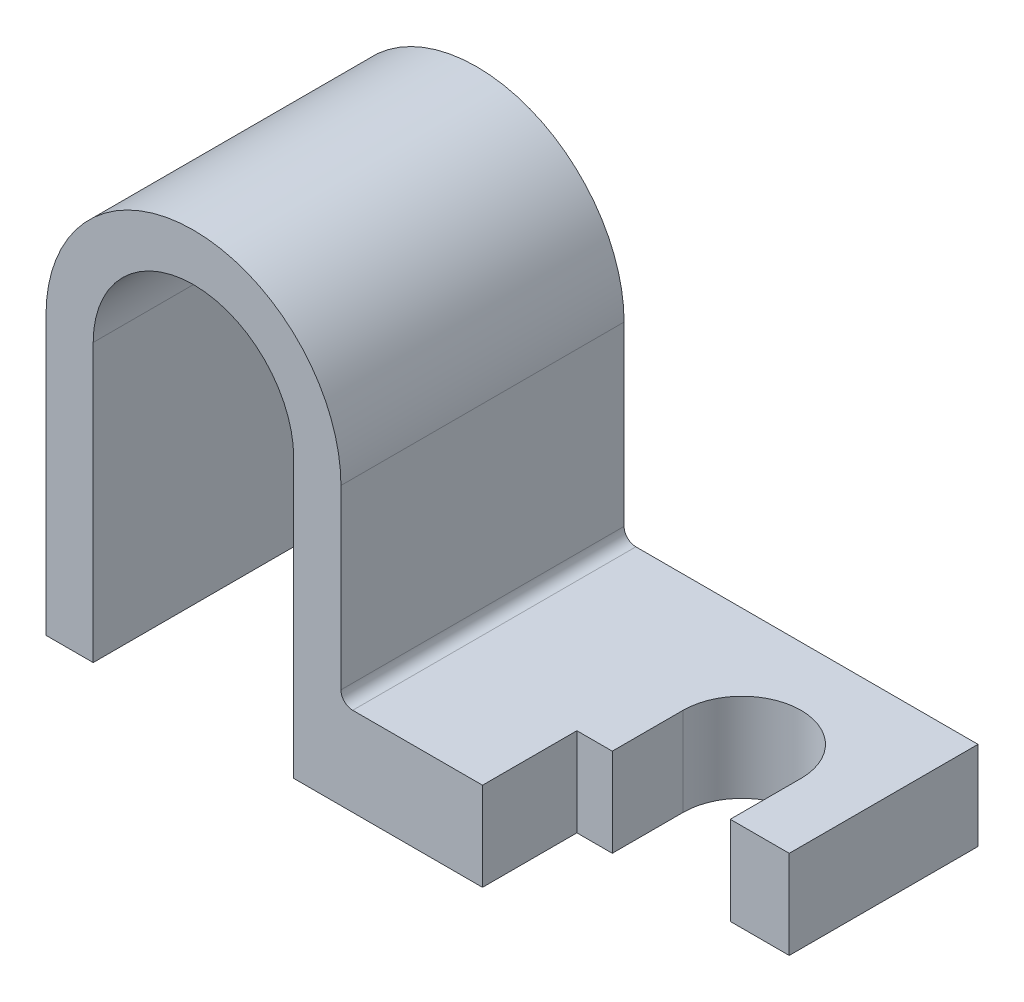
ISO-10303-21;
HEADER;
FILE_DESCRIPTION(('STEP AP214'),'2;1');
FILE_NAME('part.step','',(''),(''),'','','');
FILE_SCHEMA(('AUTOMOTIVE_DESIGN { 1 0 10303 214 1 1 1 1 }'));
ENDSEC;
DATA;
#1=APPLICATION_CONTEXT('core data for automotive mechanical design processes');
#2=APPLICATION_PROTOCOL_DEFINITION('international standard','automotive_design',2000,#1);
#3=PRODUCT_CONTEXT('',#1,'mechanical');
#4=PRODUCT('Part','Part','',(#3));
#5=PRODUCT_RELATED_PRODUCT_CATEGORY('part','',(#4));
#6=PRODUCT_DEFINITION_FORMATION('','',#4);
#7=PRODUCT_DEFINITION_CONTEXT('part definition',#1,'design');
#8=PRODUCT_DEFINITION('design','',#6,#7);
#9=PRODUCT_DEFINITION_SHAPE('','',#8);
#10=(LENGTH_UNIT() NAMED_UNIT(*) SI_UNIT(.MILLI.,.METRE.));
#11=(NAMED_UNIT(*) PLANE_ANGLE_UNIT() SI_UNIT($,.RADIAN.));
#12=(NAMED_UNIT(*) SI_UNIT($,.STERADIAN.) SOLID_ANGLE_UNIT());
#13=UNCERTAINTY_MEASURE_WITH_UNIT(LENGTH_MEASURE(1.E-05),#10,'distance_accuracy_value','');
#14=(GEOMETRIC_REPRESENTATION_CONTEXT(3) GLOBAL_UNCERTAINTY_ASSIGNED_CONTEXT((#13)) GLOBAL_UNIT_ASSIGNED_CONTEXT((#10,
#11,#12)) REPRESENTATION_CONTEXT('',''));
#15=CARTESIAN_POINT('',(0.,0.,0.));
#16=DIRECTION('',(0.,0.,1.));
#17=DIRECTION('',(1.,0.,0.));
#18=AXIS2_PLACEMENT_3D('',#15,#16,#17);
#19=CARTESIAN_POINT('',(0.,47.,-48.));
#20=DIRECTION('',(-1.,0.,0.));
#21=DIRECTION('',(0.,0.,1.));
#22=AXIS2_PLACEMENT_3D('',#19,#20,#21);
#23=PLANE('',#22);
#24=DIRECTION('',(0.,-1.,0.));
#25=VECTOR('',#24,1.);
#26=CARTESIAN_POINT('',(0.,47.,0.));
#27=LINE('',#26,#25);
#28=CARTESIAN_POINT('',(0.,47.,0.));
#29=VERTEX_POINT('',#28);
#30=CARTESIAN_POINT('',(0.,0.,0.));
#31=VERTEX_POINT('',#30);
#32=EDGE_CURVE('E243',#29,#31,#27,.T.);
#33=ORIENTED_EDGE('',*,*,#32,.F.);
#34=DIRECTION('',(0.,0.,1.));
#35=VECTOR('',#34,1.);
#36=CARTESIAN_POINT('',(0.,47.,-48.));
#37=LINE('',#36,#35);
#38=CARTESIAN_POINT('',(0.,47.,-48.));
#39=VERTEX_POINT('',#38);
#40=EDGE_CURVE('E181',#39,#29,#37,.T.);
#41=ORIENTED_EDGE('',*,*,#40,.F.);
#42=DIRECTION('',(0.,-1.,0.));
#43=VECTOR('',#42,1.);
#44=CARTESIAN_POINT('',(0.,47.,-48.));
#45=LINE('',#44,#43);
#46=CARTESIAN_POINT('',(0.,0.,-48.));
#47=VERTEX_POINT('',#46);
#48=EDGE_CURVE('E231',#39,#47,#45,.T.);
#49=ORIENTED_EDGE('',*,*,#48,.T.);
#50=DIRECTION('',(0.,0.,1.));
#51=VECTOR('',#50,1.);
#52=CARTESIAN_POINT('',(0.,0.,-48.));
#53=LINE('',#52,#51);
#54=EDGE_CURVE('E194',#47,#31,#53,.T.);
#55=ORIENTED_EDGE('',*,*,#54,.T.);
#56=EDGE_LOOP('',(#33,#41,#49,#55));
#57=FACE_BOUND('',#56,.T.);
#58=ADVANCED_FACE('F33',(#57),#23,.T.);
#59=CARTESIAN_POINT('',(25.,47.,-48.));
#60=DIRECTION('',(0.,0.,1.));
#61=DIRECTION('',(1.,0.,0.));
#62=AXIS2_PLACEMENT_3D('',#59,#60,#61);
#63=CYLINDRICAL_SURFACE('',#62,25.);
#64=CARTESIAN_POINT('',(25.,47.,0.));
#65=DIRECTION('',(0.,0.,1.));
#66=DIRECTION('',(1.,0.,0.));
#67=AXIS2_PLACEMENT_3D('',#64,#65,#66);
#68=CIRCLE('',#67,25.);
#69=CARTESIAN_POINT('',(50.,47.,0.));
#70=VERTEX_POINT('',#69);
#71=EDGE_CURVE('E224',#70,#29,#68,.T.);
#72=ORIENTED_EDGE('',*,*,#71,.F.);
#73=DIRECTION('',(0.,0.,1.));
#74=VECTOR('',#73,1.);
#75=CARTESIAN_POINT('',(50.,47.,-48.));
#76=LINE('',#75,#74);
#77=CARTESIAN_POINT('',(50.,47.,-48.));
#78=VERTEX_POINT('',#77);
#79=EDGE_CURVE('E177',#78,#70,#76,.T.);
#80=ORIENTED_EDGE('',*,*,#79,.F.);
#81=CARTESIAN_POINT('',(25.,47.,-48.));
#82=DIRECTION('',(0.,0.,1.));
#83=DIRECTION('',(1.,0.,0.));
#84=AXIS2_PLACEMENT_3D('',#81,#82,#83);
#85=CIRCLE('',#84,25.);
#86=EDGE_CURVE('E196',#78,#39,#85,.T.);
#87=ORIENTED_EDGE('',*,*,#86,.T.);
#88=ORIENTED_EDGE('',*,*,#40,.T.);
#89=EDGE_LOOP('',(#72,#80,#87,#88));
#90=FACE_BOUND('',#89,.T.);
#91=ADVANCED_FACE('F236',(#90),#63,.T.);
#92=CARTESIAN_POINT('',(50.,15.,-48.));
#93=DIRECTION('',(1.,0.,0.));
#94=DIRECTION('',(0.,0.,-1.));
#95=AXIS2_PLACEMENT_3D('',#92,#93,#94);
#96=PLANE('',#95);
#97=DIRECTION('',(0.,1.,0.));
#98=VECTOR('',#97,1.);
#99=CARTESIAN_POINT('',(50.,15.,0.));
#100=LINE('',#99,#98);
#101=CARTESIAN_POINT('',(50.,17.,0.));
#102=VERTEX_POINT('',#101);
#103=EDGE_CURVE('E221',#102,#70,#100,.T.);
#104=ORIENTED_EDGE('',*,*,#103,.F.);
#105=DIRECTION('',(0.,0.,1.));
#106=VECTOR('',#105,1.);
#107=CARTESIAN_POINT('',(50.,17.,-48.));
#108=LINE('',#107,#106);
#109=CARTESIAN_POINT('',(50.,17.,-48.));
#110=VERTEX_POINT('',#109);
#111=EDGE_CURVE('E48',#102,#110,#108,.F.);
#112=ORIENTED_EDGE('',*,*,#111,.T.);
#113=DIRECTION('',(0.,1.,0.));
#114=VECTOR('',#113,1.);
#115=CARTESIAN_POINT('',(50.,15.,-48.));
#116=LINE('',#115,#114);
#117=EDGE_CURVE('E250',#110,#78,#116,.T.);
#118=ORIENTED_EDGE('',*,*,#117,.T.);
#119=ORIENTED_EDGE('',*,*,#79,.T.);
#120=EDGE_LOOP('',(#104,#112,#118,#119));
#121=FACE_BOUND('',#120,.T.);
#122=ADVANCED_FACE('F249',(#121),#96,.T.);
#123=CARTESIAN_POINT('',(110.,15.,-48.));
#124=DIRECTION('',(0.,1.,0.));
#125=DIRECTION('',(-1.,0.,0.));
#126=AXIS2_PLACEMENT_3D('',#123,#124,#125);
#127=PLANE('',#126);
#128=DIRECTION('',(-1.,0.,0.));
#129=VECTOR('',#128,1.);
#130=CARTESIAN_POINT('',(110.,15.,-48.));
#131=LINE('',#130,#129);
#132=CARTESIAN_POINT('',(110.,15.,-48.));
#133=VERTEX_POINT('',#132);
#134=CARTESIAN_POINT('',(52.,15.,-48.));
#135=VERTEX_POINT('',#134);
#136=EDGE_CURVE('E216',#133,#135,#131,.T.);
#137=ORIENTED_EDGE('',*,*,#136,.T.);
#138=DIRECTION('',(0.,0.,1.));
#139=VECTOR('',#138,1.);
#140=CARTESIAN_POINT('',(52.,15.,0.));
#141=LINE('',#140,#139);
#142=CARTESIAN_POINT('',(52.,15.,0.));
#143=VERTEX_POINT('',#142);
#144=EDGE_CURVE('E209',#135,#143,#141,.T.);
#145=ORIENTED_EDGE('',*,*,#144,.T.);
#146=DIRECTION('',(-1.,0.,0.));
#147=VECTOR('',#146,1.);
#148=CARTESIAN_POINT('',(110.,15.,0.));
#149=LINE('',#148,#147);
#150=CARTESIAN_POINT('',(74.,15.,0.));
#151=VERTEX_POINT('',#150);
#152=EDGE_CURVE('E215',#151,#143,#149,.T.);
#153=ORIENTED_EDGE('',*,*,#152,.F.);
#154=DIRECTION('',(0.,0.,1.));
#155=VECTOR('',#154,1.);
#156=CARTESIAN_POINT('',(74.,15.,0.));
#157=LINE('',#156,#155);
#158=CARTESIAN_POINT('',(74.,15.,-16.));
#159=VERTEX_POINT('',#158);
#160=EDGE_CURVE('E162',#159,#151,#157,.T.);
#161=ORIENTED_EDGE('',*,*,#160,.F.);
#162=DIRECTION('',(-1.,0.,0.));
#163=VECTOR('',#162,1.);
#164=CARTESIAN_POINT('',(74.,15.,-16.));
#165=LINE('',#164,#163);
#166=CARTESIAN_POINT('',(80.,15.,-16.));
#167=VERTEX_POINT('',#166);
#168=EDGE_CURVE('E485',#167,#159,#165,.T.);
#169=ORIENTED_EDGE('',*,*,#168,.F.);
#170=DIRECTION('',(0.,0.,1.));
#171=VECTOR('',#170,1.);
#172=CARTESIAN_POINT('',(80.,15.,-16.));
#173=LINE('',#172,#171);
#174=CARTESIAN_POINT('',(80.,15.,-28.));
#175=VERTEX_POINT('',#174);
#176=EDGE_CURVE('E472',#175,#167,#173,.T.);
#177=ORIENTED_EDGE('',*,*,#176,.F.);
#178=CARTESIAN_POINT('',(90.,15.,-28.));
#179=DIRECTION('',(0.,1.,0.));
#180=DIRECTION('',(1.,0.,0.));
#181=AXIS2_PLACEMENT_3D('',#178,#179,#180);
#182=CIRCLE('',#181,9.99999999999999);
#183=CARTESIAN_POINT('',(100.,15.,-28.));
#184=VERTEX_POINT('',#183);
#185=EDGE_CURVE('E488',#184,#175,#182,.T.);
#186=ORIENTED_EDGE('',*,*,#185,.F.);
#187=DIRECTION('',(0.,0.,-1.));
#188=VECTOR('',#187,1.);
#189=CARTESIAN_POINT('',(100.,15.,-28.));
#190=LINE('',#189,#188);
#191=CARTESIAN_POINT('',(100.,15.,-16.));
#192=VERTEX_POINT('',#191);
#193=EDGE_CURVE('E171',#192,#184,#190,.T.);
#194=ORIENTED_EDGE('',*,*,#193,.F.);
#195=DIRECTION('',(-1.,0.,0.));
#196=VECTOR('',#195,1.);
#197=CARTESIAN_POINT('',(100.,15.,-16.));
#198=LINE('',#197,#196);
#199=CARTESIAN_POINT('',(110.,15.,-16.));
#200=VERTEX_POINT('',#199);
#201=EDGE_CURVE('E154',#200,#192,#198,.T.);
#202=ORIENTED_EDGE('',*,*,#201,.F.);
#203=DIRECTION('',(0.,0.,1.));
#204=VECTOR('',#203,1.);
#205=CARTESIAN_POINT('',(110.,15.,-48.));
#206=LINE('',#205,#204);
#207=EDGE_CURVE('E167',#133,#200,#206,.T.);
#208=ORIENTED_EDGE('',*,*,#207,.F.);
#209=EDGE_LOOP('',(#137,#145,#153,#161,#169,#177,#186,#194,#202,#208));
#210=FACE_BOUND('',#209,.T.);
#211=ADVANCED_FACE('F166',(#210),#127,.T.);
#212=CARTESIAN_POINT('',(110.,0.,-48.));
#213=DIRECTION('',(1.,0.,0.));
#214=DIRECTION('',(0.,1.,0.));
#215=AXIS2_PLACEMENT_3D('',#212,#213,#214);
#216=PLANE('',#215);
#217=DIRECTION('',(0.,1.,0.));
#218=VECTOR('',#217,1.);
#219=CARTESIAN_POINT('',(110.,-33.,-16.));
#220=LINE('',#219,#218);
#221=CARTESIAN_POINT('',(110.,0.,-16.));
#222=VERTEX_POINT('',#221);
#223=EDGE_CURVE('E150',#222,#200,#220,.T.);
#224=ORIENTED_EDGE('',*,*,#223,.F.);
#225=DIRECTION('',(0.,0.,1.));
#226=VECTOR('',#225,1.);
#227=CARTESIAN_POINT('',(110.,0.,-48.));
#228=LINE('',#227,#226);
#229=CARTESIAN_POINT('',(110.,0.,-48.));
#230=VERTEX_POINT('',#229);
#231=EDGE_CURVE('E178',#230,#222,#228,.T.);
#232=ORIENTED_EDGE('',*,*,#231,.F.);
#233=DIRECTION('',(0.,1.,0.));
#234=VECTOR('',#233,1.);
#235=CARTESIAN_POINT('',(110.,0.,-48.));
#236=LINE('',#235,#234);
#237=EDGE_CURVE('E176',#230,#133,#236,.T.);
#238=ORIENTED_EDGE('',*,*,#237,.T.);
#239=ORIENTED_EDGE('',*,*,#207,.T.);
#240=EDGE_LOOP('',(#224,#232,#238,#239));
#241=FACE_BOUND('',#240,.T.);
#242=ADVANCED_FACE('F174',(#241),#216,.T.);
#243=CARTESIAN_POINT('',(42.,0.,-48.));
#244=DIRECTION('',(0.,-1.,0.));
#245=DIRECTION('',(0.,0.,-1.));
#246=AXIS2_PLACEMENT_3D('',#243,#244,#245);
#247=PLANE('',#246);
#248=DIRECTION('',(0.,0.,-1.));
#249=VECTOR('',#248,1.);
#250=CARTESIAN_POINT('',(74.,0.,-48.));
#251=LINE('',#250,#249);
#252=CARTESIAN_POINT('',(74.,0.,0.));
#253=VERTEX_POINT('',#252);
#254=CARTESIAN_POINT('',(74.,0.,-16.));
#255=VERTEX_POINT('',#254);
#256=EDGE_CURVE('E247',#253,#255,#251,.T.);
#257=ORIENTED_EDGE('',*,*,#256,.F.);
#258=DIRECTION('',(1.,0.,0.));
#259=VECTOR('',#258,1.);
#260=CARTESIAN_POINT('',(42.,0.,0.));
#261=LINE('',#260,#259);
#262=CARTESIAN_POINT('',(42.,0.,0.));
#263=VERTEX_POINT('',#262);
#264=EDGE_CURVE('E222',#263,#253,#261,.T.);
#265=ORIENTED_EDGE('',*,*,#264,.F.);
#266=DIRECTION('',(0.,0.,1.));
#267=VECTOR('',#266,1.);
#268=CARTESIAN_POINT('',(42.,0.,-48.));
#269=LINE('',#268,#267);
#270=CARTESIAN_POINT('',(42.,0.,-48.));
#271=VERTEX_POINT('',#270);
#272=EDGE_CURVE('E183',#271,#263,#269,.T.);
#273=ORIENTED_EDGE('',*,*,#272,.F.);
#274=DIRECTION('',(1.,0.,0.));
#275=VECTOR('',#274,1.);
#276=CARTESIAN_POINT('',(42.,0.,-48.));
#277=LINE('',#276,#275);
#278=EDGE_CURVE('E299',#271,#230,#277,.T.);
#279=ORIENTED_EDGE('',*,*,#278,.T.);
#280=ORIENTED_EDGE('',*,*,#231,.T.);
#281=DIRECTION('',(1.,0.,0.));
#282=VECTOR('',#281,1.);
#283=CARTESIAN_POINT('',(42.,0.,-16.));
#284=LINE('',#283,#282);
#285=CARTESIAN_POINT('',(100.,0.,-16.));
#286=VERTEX_POINT('',#285);
#287=EDGE_CURVE('E157',#286,#222,#284,.T.);
#288=ORIENTED_EDGE('',*,*,#287,.F.);
#289=DIRECTION('',(0.,0.,1.));
#290=VECTOR('',#289,1.);
#291=CARTESIAN_POINT('',(100.,0.,-48.0000000000001));
#292=LINE('',#291,#290);
#293=CARTESIAN_POINT('',(100.,0.,-28.));
#294=VERTEX_POINT('',#293);
#295=EDGE_CURVE('E201',#294,#286,#292,.T.);
#296=ORIENTED_EDGE('',*,*,#295,.F.);
#297=CARTESIAN_POINT('',(90.,0.,-28.));
#298=DIRECTION('',(0.,-1.,0.));
#299=DIRECTION('',(0.,0.,-1.));
#300=AXIS2_PLACEMENT_3D('',#297,#298,#299);
#301=CIRCLE('',#300,9.99999999999999);
#302=CARTESIAN_POINT('',(80.,0.,-28.));
#303=VERTEX_POINT('',#302);
#304=EDGE_CURVE('E203',#303,#294,#301,.T.);
#305=ORIENTED_EDGE('',*,*,#304,.F.);
#306=DIRECTION('',(0.,0.,-1.));
#307=VECTOR('',#306,1.);
#308=CARTESIAN_POINT('',(80.,0.,-48.));
#309=LINE('',#308,#307);
#310=CARTESIAN_POINT('',(80.,0.,-16.));
#311=VERTEX_POINT('',#310);
#312=EDGE_CURVE('E205',#311,#303,#309,.T.);
#313=ORIENTED_EDGE('',*,*,#312,.F.);
#314=DIRECTION('',(1.,0.,0.));
#315=VECTOR('',#314,1.);
#316=CARTESIAN_POINT('',(42.,0.,-16.));
#317=LINE('',#316,#315);
#318=EDGE_CURVE('E207',#255,#311,#317,.T.);
#319=ORIENTED_EDGE('',*,*,#318,.F.);
#320=EDGE_LOOP('',(#257,#265,#273,#279,#280,#288,#296,#305,#313,#319));
#321=FACE_BOUND('',#320,.T.);
#322=ADVANCED_FACE('F277',(#321),#247,.T.);
#323=CARTESIAN_POINT('',(42.,47.,-48.));
#324=DIRECTION('',(-1.,0.,0.));
#325=DIRECTION('',(0.,-1.,0.));
#326=AXIS2_PLACEMENT_3D('',#323,#324,#325);
#327=PLANE('',#326);
#328=DIRECTION('',(0.,-1.,0.));
#329=VECTOR('',#328,1.);
#330=CARTESIAN_POINT('',(42.,47.,0.));
#331=LINE('',#330,#329);
#332=CARTESIAN_POINT('',(42.,47.,0.));
#333=VERTEX_POINT('',#332);
#334=EDGE_CURVE('E226',#333,#263,#331,.T.);
#335=ORIENTED_EDGE('',*,*,#334,.F.);
#336=DIRECTION('',(0.,0.,1.));
#337=VECTOR('',#336,1.);
#338=CARTESIAN_POINT('',(42.,47.,-48.));
#339=LINE('',#338,#337);
#340=CARTESIAN_POINT('',(42.,47.,-48.));
#341=VERTEX_POINT('',#340);
#342=EDGE_CURVE('E188',#341,#333,#339,.T.);
#343=ORIENTED_EDGE('',*,*,#342,.F.);
#344=DIRECTION('',(0.,-1.,0.));
#345=VECTOR('',#344,1.);
#346=CARTESIAN_POINT('',(42.,47.,-48.));
#347=LINE('',#346,#345);
#348=EDGE_CURVE('E272',#341,#271,#347,.T.);
#349=ORIENTED_EDGE('',*,*,#348,.T.);
#350=ORIENTED_EDGE('',*,*,#272,.T.);
#351=EDGE_LOOP('',(#335,#343,#349,#350));
#352=FACE_BOUND('',#351,.T.);
#353=ADVANCED_FACE('F269',(#352),#327,.T.);
#354=CARTESIAN_POINT('',(25.,47.,-48.));
#355=DIRECTION('',(0.,0.,1.));
#356=DIRECTION('',(1.,0.,0.));
#357=AXIS2_PLACEMENT_3D('',#354,#355,#356);
#358=CYLINDRICAL_SURFACE('',#357,17.);
#359=CARTESIAN_POINT('',(25.,47.,0.));
#360=DIRECTION('',(0.,0.,-1.));
#361=DIRECTION('',(-1.,0.,0.));
#362=AXIS2_PLACEMENT_3D('',#359,#360,#361);
#363=CIRCLE('',#362,17.);
#364=CARTESIAN_POINT('',(8.00000000000001,47.,0.));
#365=VERTEX_POINT('',#364);
#366=EDGE_CURVE('E262',#365,#333,#363,.T.);
#367=ORIENTED_EDGE('',*,*,#366,.F.);
#368=DIRECTION('',(0.,0.,1.));
#369=VECTOR('',#368,1.);
#370=CARTESIAN_POINT('',(8.00000000000001,47.,-48.));
#371=LINE('',#370,#369);
#372=CARTESIAN_POINT('',(8.00000000000001,47.,-48.));
#373=VERTEX_POINT('',#372);
#374=EDGE_CURVE('E190',#373,#365,#371,.T.);
#375=ORIENTED_EDGE('',*,*,#374,.F.);
#376=CARTESIAN_POINT('',(25.,47.,-48.));
#377=DIRECTION('',(0.,0.,-1.));
#378=DIRECTION('',(-1.,0.,0.));
#379=AXIS2_PLACEMENT_3D('',#376,#377,#378);
#380=CIRCLE('',#379,17.);
#381=EDGE_CURVE('E295',#373,#341,#380,.T.);
#382=ORIENTED_EDGE('',*,*,#381,.T.);
#383=ORIENTED_EDGE('',*,*,#342,.T.);
#384=EDGE_LOOP('',(#367,#375,#382,#383));
#385=FACE_BOUND('',#384,.T.);
#386=ADVANCED_FACE('F321',(#385),#358,.F.);
#387=CARTESIAN_POINT('',(8.00000000000001,0.,-48.));
#388=DIRECTION('',(1.,0.,0.));
#389=DIRECTION('',(0.,1.,0.));
#390=AXIS2_PLACEMENT_3D('',#387,#388,#389);
#391=PLANE('',#390);
#392=DIRECTION('',(0.,1.,0.));
#393=VECTOR('',#392,1.);
#394=CARTESIAN_POINT('',(8.00000000000001,0.,0.));
#395=LINE('',#394,#393);
#396=CARTESIAN_POINT('',(8.00000000000001,0.,0.));
#397=VERTEX_POINT('',#396);
#398=EDGE_CURVE('E259',#397,#365,#395,.T.);
#399=ORIENTED_EDGE('',*,*,#398,.F.);
#400=DIRECTION('',(0.,0.,1.));
#401=VECTOR('',#400,1.);
#402=CARTESIAN_POINT('',(8.00000000000001,0.,-48.));
#403=LINE('',#402,#401);
#404=CARTESIAN_POINT('',(8.00000000000001,0.,-48.));
#405=VERTEX_POINT('',#404);
#406=EDGE_CURVE('E192',#405,#397,#403,.T.);
#407=ORIENTED_EDGE('',*,*,#406,.F.);
#408=DIRECTION('',(0.,1.,0.));
#409=VECTOR('',#408,1.);
#410=CARTESIAN_POINT('',(8.00000000000001,0.,-48.));
#411=LINE('',#410,#409);
#412=EDGE_CURVE('E292',#405,#373,#411,.T.);
#413=ORIENTED_EDGE('',*,*,#412,.T.);
#414=ORIENTED_EDGE('',*,*,#374,.T.);
#415=EDGE_LOOP('',(#399,#407,#413,#414));
#416=FACE_BOUND('',#415,.T.);
#417=ADVANCED_FACE('F317',(#416),#391,.T.);
#418=CARTESIAN_POINT('',(0.,0.,-48.));
#419=DIRECTION('',(0.,-1.,0.));
#420=DIRECTION('',(0.,0.,-1.));
#421=AXIS2_PLACEMENT_3D('',#418,#419,#420);
#422=PLANE('',#421);
#423=DIRECTION('',(1.,0.,0.));
#424=VECTOR('',#423,1.);
#425=CARTESIAN_POINT('',(0.,0.,0.));
#426=LINE('',#425,#424);
#427=EDGE_CURVE('E246',#31,#397,#426,.T.);
#428=ORIENTED_EDGE('',*,*,#427,.F.);
#429=ORIENTED_EDGE('',*,*,#54,.F.);
#430=DIRECTION('',(1.,0.,0.));
#431=VECTOR('',#430,1.);
#432=CARTESIAN_POINT('',(0.,0.,-48.));
#433=LINE('',#432,#431);
#434=EDGE_CURVE('E289',#47,#405,#433,.T.);
#435=ORIENTED_EDGE('',*,*,#434,.T.);
#436=ORIENTED_EDGE('',*,*,#406,.T.);
#437=EDGE_LOOP('',(#428,#429,#435,#436));
#438=FACE_BOUND('',#437,.T.);
#439=ADVANCED_FACE('F314',(#438),#422,.T.);
#440=CARTESIAN_POINT('',(25.,47.,-48.));
#441=DIRECTION('',(0.,0.,-1.));
#442=DIRECTION('',(-1.,0.,0.));
#443=AXIS2_PLACEMENT_3D('',#440,#441,#442);
#444=PLANE('',#443);
#445=ORIENTED_EDGE('',*,*,#48,.F.);
#446=ORIENTED_EDGE('',*,*,#86,.F.);
#447=ORIENTED_EDGE('',*,*,#117,.F.);
#448=CARTESIAN_POINT('',(52.,17.,-48.));
#449=DIRECTION('',(0.,0.,-1.));
#450=DIRECTION('',(-1.,0.,0.));
#451=AXIS2_PLACEMENT_3D('',#448,#449,#450);
#452=CIRCLE('',#451,2.);
#453=EDGE_CURVE('E11',#110,#135,#452,.F.);
#454=ORIENTED_EDGE('',*,*,#453,.T.);
#455=ORIENTED_EDGE('',*,*,#136,.F.);
#456=ORIENTED_EDGE('',*,*,#237,.F.);
#457=ORIENTED_EDGE('',*,*,#278,.F.);
#458=ORIENTED_EDGE('',*,*,#348,.F.);
#459=ORIENTED_EDGE('',*,*,#381,.F.);
#460=ORIENTED_EDGE('',*,*,#412,.F.);
#461=ORIENTED_EDGE('',*,*,#434,.F.);
#462=EDGE_LOOP('',(#445,#446,#447,#454,#455,#456,#457,#458,#459,#460,#461));
#463=FACE_BOUND('',#462,.T.);
#464=ADVANCED_FACE('F252',(#463),#444,.T.);
#465=CARTESIAN_POINT('',(25.,47.,0.));
#466=DIRECTION('',(0.,0.,-1.));
#467=DIRECTION('',(-1.,0.,0.));
#468=AXIS2_PLACEMENT_3D('',#465,#466,#467);
#469=PLANE('',#468);
#470=ORIENTED_EDGE('',*,*,#264,.T.);
#471=DIRECTION('',(0.,1.,0.));
#472=VECTOR('',#471,1.);
#473=CARTESIAN_POINT('',(74.,47.,0.));
#474=LINE('',#473,#472);
#475=EDGE_CURVE('E197',#253,#151,#474,.T.);
#476=ORIENTED_EDGE('',*,*,#475,.T.);
#477=ORIENTED_EDGE('',*,*,#152,.T.);
#478=CARTESIAN_POINT('',(52.,17.,0.));
#479=DIRECTION('',(0.,0.,-1.));
#480=DIRECTION('',(-1.,0.,0.));
#481=AXIS2_PLACEMENT_3D('',#478,#479,#480);
#482=CIRCLE('',#481,2.);
#483=EDGE_CURVE('E41',#143,#102,#482,.T.);
#484=ORIENTED_EDGE('',*,*,#483,.T.);
#485=ORIENTED_EDGE('',*,*,#103,.T.);
#486=ORIENTED_EDGE('',*,*,#71,.T.);
#487=ORIENTED_EDGE('',*,*,#32,.T.);
#488=ORIENTED_EDGE('',*,*,#427,.T.);
#489=ORIENTED_EDGE('',*,*,#398,.T.);
#490=ORIENTED_EDGE('',*,*,#366,.T.);
#491=ORIENTED_EDGE('',*,*,#334,.T.);
#492=EDGE_LOOP('',(#470,#476,#477,#484,#485,#486,#487,#488,#489,#490,#491));
#493=FACE_BOUND('',#492,.T.);
#494=ADVANCED_FACE('F220',(#493),#469,.F.);
#495=CARTESIAN_POINT('',(74.,-33.,0.));
#496=DIRECTION('',(-1.,0.,0.));
#497=DIRECTION('',(0.,-1.,0.));
#498=AXIS2_PLACEMENT_3D('',#495,#496,#497);
#499=PLANE('',#498);
#500=ORIENTED_EDGE('',*,*,#256,.T.);
#501=DIRECTION('',(0.,1.,0.));
#502=VECTOR('',#501,1.);
#503=CARTESIAN_POINT('',(74.,-33.,-16.));
#504=LINE('',#503,#502);
#505=EDGE_CURVE('E282',#255,#159,#504,.T.);
#506=ORIENTED_EDGE('',*,*,#505,.T.);
#507=ORIENTED_EDGE('',*,*,#160,.T.);
#508=ORIENTED_EDGE('',*,*,#475,.F.);
#509=EDGE_LOOP('',(#500,#506,#507,#508));
#510=FACE_BOUND('',#509,.T.);
#511=ADVANCED_FACE('F338',(#510),#499,.F.);
#512=CARTESIAN_POINT('',(74.,-33.,-16.));
#513=DIRECTION('',(0.,0.,-1.));
#514=DIRECTION('',(-1.,0.,0.));
#515=AXIS2_PLACEMENT_3D('',#512,#513,#514);
#516=PLANE('',#515);
#517=ORIENTED_EDGE('',*,*,#318,.T.);
#518=DIRECTION('',(0.,1.,0.));
#519=VECTOR('',#518,1.);
#520=CARTESIAN_POINT('',(80.,-33.,-16.));
#521=LINE('',#520,#519);
#522=EDGE_CURVE('E284',#311,#167,#521,.T.);
#523=ORIENTED_EDGE('',*,*,#522,.T.);
#524=ORIENTED_EDGE('',*,*,#168,.T.);
#525=ORIENTED_EDGE('',*,*,#505,.F.);
#526=EDGE_LOOP('',(#517,#523,#524,#525));
#527=FACE_BOUND('',#526,.T.);
#528=ADVANCED_FACE('F351',(#527),#516,.F.);
#529=CARTESIAN_POINT('',(80.,-33.,-16.));
#530=DIRECTION('',(-1.,0.,0.));
#531=DIRECTION('',(0.,0.,1.));
#532=AXIS2_PLACEMENT_3D('',#529,#530,#531);
#533=PLANE('',#532);
#534=ORIENTED_EDGE('',*,*,#312,.T.);
#535=DIRECTION('',(0.,1.,0.));
#536=VECTOR('',#535,1.);
#537=CARTESIAN_POINT('',(80.,-33.,-28.));
#538=LINE('',#537,#536);
#539=EDGE_CURVE('E474',#303,#175,#538,.T.);
#540=ORIENTED_EDGE('',*,*,#539,.T.);
#541=ORIENTED_EDGE('',*,*,#176,.T.);
#542=ORIENTED_EDGE('',*,*,#522,.F.);
#543=EDGE_LOOP('',(#534,#540,#541,#542));
#544=FACE_BOUND('',#543,.T.);
#545=ADVANCED_FACE('F347',(#544),#533,.F.);
#546=CARTESIAN_POINT('',(90.,-33.,-28.));
#547=DIRECTION('',(0.,1.,0.));
#548=DIRECTION('',(-1.,0.,0.));
#549=AXIS2_PLACEMENT_3D('',#546,#547,#548);
#550=CYLINDRICAL_SURFACE('',#549,9.99999999999999);
#551=ORIENTED_EDGE('',*,*,#304,.T.);
#552=DIRECTION('',(0.,1.,0.));
#553=VECTOR('',#552,1.);
#554=CARTESIAN_POINT('',(100.,-33.,-28.));
#555=LINE('',#554,#553);
#556=EDGE_CURVE('E480',#294,#184,#555,.T.);
#557=ORIENTED_EDGE('',*,*,#556,.T.);
#558=ORIENTED_EDGE('',*,*,#185,.T.);
#559=ORIENTED_EDGE('',*,*,#539,.F.);
#560=EDGE_LOOP('',(#551,#557,#558,#559));
#561=FACE_BOUND('',#560,.T.);
#562=ADVANCED_FACE('F343',(#561),#550,.F.);
#563=CARTESIAN_POINT('',(100.,-33.,-28.));
#564=DIRECTION('',(1.,0.,0.));
#565=DIRECTION('',(0.,0.,-1.));
#566=AXIS2_PLACEMENT_3D('',#563,#564,#565);
#567=PLANE('',#566);
#568=ORIENTED_EDGE('',*,*,#295,.T.);
#569=DIRECTION('',(0.,1.,0.));
#570=VECTOR('',#569,1.);
#571=CARTESIAN_POINT('',(100.,-33.,-16.));
#572=LINE('',#571,#570);
#573=EDGE_CURVE('E161',#286,#192,#572,.T.);
#574=ORIENTED_EDGE('',*,*,#573,.T.);
#575=ORIENTED_EDGE('',*,*,#193,.T.);
#576=ORIENTED_EDGE('',*,*,#556,.F.);
#577=EDGE_LOOP('',(#568,#574,#575,#576));
#578=FACE_BOUND('',#577,.T.);
#579=ADVANCED_FACE('F306',(#578),#567,.F.);
#580=CARTESIAN_POINT('',(100.,-33.,-16.));
#581=DIRECTION('',(0.,0.,-1.));
#582=DIRECTION('',(-1.,0.,0.));
#583=AXIS2_PLACEMENT_3D('',#580,#581,#582);
#584=PLANE('',#583);
#585=ORIENTED_EDGE('',*,*,#287,.T.);
#586=ORIENTED_EDGE('',*,*,#223,.T.);
#587=ORIENTED_EDGE('',*,*,#201,.T.);
#588=ORIENTED_EDGE('',*,*,#573,.F.);
#589=EDGE_LOOP('',(#585,#586,#587,#588));
#590=FACE_BOUND('',#589,.T.);
#591=ADVANCED_FACE('F152',(#590),#584,.F.);
#592=CARTESIAN_POINT('',(52.,17.,-48.));
#593=DIRECTION('',(0.,0.,-1.));
#594=DIRECTION('',(-1.,0.,0.));
#595=AXIS2_PLACEMENT_3D('',#592,#593,#594);
#596=CYLINDRICAL_SURFACE('',#595,2.);
#597=ORIENTED_EDGE('',*,*,#453,.F.);
#598=ORIENTED_EDGE('',*,*,#111,.F.);
#599=ORIENTED_EDGE('',*,*,#483,.F.);
#600=ORIENTED_EDGE('',*,*,#144,.F.);
#601=EDGE_LOOP('',(#597,#598,#599,#600));
#602=FACE_BOUND('',#601,.T.);
#603=ADVANCED_FACE('F35',(#602),#596,.F.);
#604=CLOSED_SHELL('',(#58,#91,#122,#211,#242,#322,#353,#386,#417,#439,#464,#494,#511,#528,#545,
#562,#579,#591,#603));
#605=MANIFOLD_SOLID_BREP('B2',#604);
#606=ADVANCED_BREP_SHAPE_REPRESENTATION('',(#18,#605),#14);
#607=SHAPE_DEFINITION_REPRESENTATION(#9,#606);
ENDSEC;
END-ISO-10303-21;
